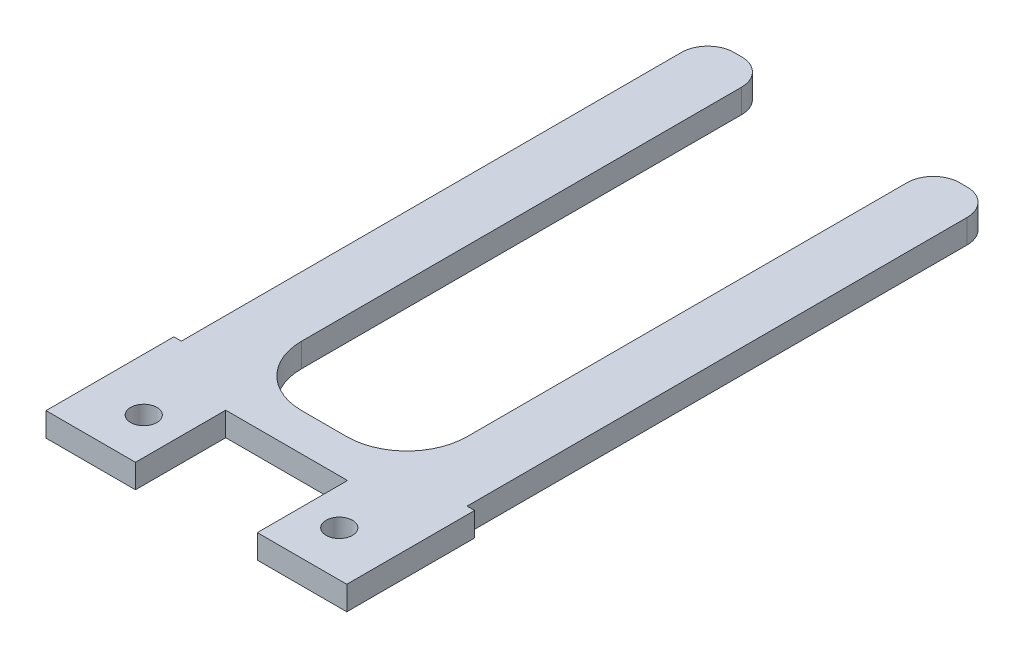
ISO-10303-21;
HEADER;
FILE_DESCRIPTION(('STEP AP214'),'2;1');
FILE_NAME('part.step','',(''),(''),'','','');
FILE_SCHEMA(('AUTOMOTIVE_DESIGN { 1 0 10303 214 1 1 1 1 }'));
ENDSEC;
DATA;
#1=APPLICATION_CONTEXT('core data for automotive mechanical design processes');
#2=APPLICATION_PROTOCOL_DEFINITION('international standard','automotive_design',2000,#1);
#3=PRODUCT_CONTEXT('',#1,'mechanical');
#4=PRODUCT('Part','Part','',(#3));
#5=PRODUCT_RELATED_PRODUCT_CATEGORY('part','',(#4));
#6=PRODUCT_DEFINITION_FORMATION('','',#4);
#7=PRODUCT_DEFINITION_CONTEXT('part definition',#1,'design');
#8=PRODUCT_DEFINITION('design','',#6,#7);
#9=PRODUCT_DEFINITION_SHAPE('','',#8);
#10=(LENGTH_UNIT() NAMED_UNIT(*) SI_UNIT(.MILLI.,.METRE.));
#11=(NAMED_UNIT(*) PLANE_ANGLE_UNIT() SI_UNIT($,.RADIAN.));
#12=(NAMED_UNIT(*) SI_UNIT($,.STERADIAN.) SOLID_ANGLE_UNIT());
#13=UNCERTAINTY_MEASURE_WITH_UNIT(LENGTH_MEASURE(1.E-05),#10,'distance_accuracy_value','');
#14=(GEOMETRIC_REPRESENTATION_CONTEXT(3) GLOBAL_UNCERTAINTY_ASSIGNED_CONTEXT((#13)) GLOBAL_UNIT_ASSIGNED_CONTEXT((#10,
#11,#12)) REPRESENTATION_CONTEXT('',''));
#15=CARTESIAN_POINT('',(0.,0.,0.));
#16=DIRECTION('',(0.,0.,1.));
#17=DIRECTION('',(1.,0.,0.));
#18=AXIS2_PLACEMENT_3D('',#15,#16,#17);
#19=CARTESIAN_POINT('',(15.5,1.5875,-71.5));
#20=DIRECTION('',(0.,-1.,0.));
#21=DIRECTION('',(0.,0.,-1.));
#22=AXIS2_PLACEMENT_3D('',#19,#20,#21);
#23=CYLINDRICAL_SURFACE('',#22,3.5);
#24=CARTESIAN_POINT('',(15.5,-1.5875,-71.5));
#25=DIRECTION('',(0.,1.,0.));
#26=DIRECTION('',(0.,0.,1.));
#27=AXIS2_PLACEMENT_3D('',#24,#25,#26);
#28=CIRCLE('',#27,3.5);
#29=CARTESIAN_POINT('',(15.5,-1.5875,-75.));
#30=VERTEX_POINT('',#29);
#31=CARTESIAN_POINT('',(19.,-1.5875,-71.5));
#32=VERTEX_POINT('',#31);
#33=EDGE_CURVE('E189',#30,#32,#28,.F.);
#34=ORIENTED_EDGE('',*,*,#33,.F.);
#35=DIRECTION('',(0.,-1.,0.));
#36=VECTOR('',#35,1.);
#37=CARTESIAN_POINT('',(15.5,1.5875,-75.));
#38=LINE('',#37,#36);
#39=CARTESIAN_POINT('',(15.5,1.5875,-75.));
#40=VERTEX_POINT('',#39);
#41=EDGE_CURVE('E184',#40,#30,#38,.T.);
#42=ORIENTED_EDGE('',*,*,#41,.F.);
#43=CARTESIAN_POINT('',(15.5,1.5875,-71.5));
#44=DIRECTION('',(0.,1.,0.));
#45=DIRECTION('',(0.,0.,1.));
#46=AXIS2_PLACEMENT_3D('',#43,#44,#45);
#47=CIRCLE('',#46,3.5);
#48=CARTESIAN_POINT('',(19.,1.5875,-71.5));
#49=VERTEX_POINT('',#48);
#50=EDGE_CURVE('E187',#40,#49,#47,.F.);
#51=ORIENTED_EDGE('',*,*,#50,.T.);
#52=DIRECTION('',(0.,-1.,0.));
#53=VECTOR('',#52,1.);
#54=CARTESIAN_POINT('',(19.,1.5875,-71.5));
#55=LINE('',#54,#53);
#56=EDGE_CURVE('E265',#49,#32,#55,.T.);
#57=ORIENTED_EDGE('',*,*,#56,.T.);
#58=EDGE_LOOP('',(#34,#42,#51,#57));
#59=FACE_BOUND('',#58,.T.);
#60=ADVANCED_FACE('F35',(#59),#23,.T.);
#61=CARTESIAN_POINT('',(0.,1.5875,-75.));
#62=DIRECTION('',(0.,0.,1.));
#63=DIRECTION('',(1.,0.,0.));
#64=AXIS2_PLACEMENT_3D('',#61,#62,#63);
#65=PLANE('',#64);
#66=DIRECTION('',(-1.,0.,0.));
#67=VECTOR('',#66,1.);
#68=CARTESIAN_POINT('',(0.,-1.5875,-75.));
#69=LINE('',#68,#67);
#70=CARTESIAN_POINT('',(14.5,-1.5875,-75.));
#71=VERTEX_POINT('',#70);
#72=EDGE_CURVE('E267',#30,#71,#69,.T.);
#73=ORIENTED_EDGE('',*,*,#72,.T.);
#74=DIRECTION('',(0.,-1.,0.));
#75=VECTOR('',#74,1.);
#76=CARTESIAN_POINT('',(14.5,1.5875,-75.));
#77=LINE('',#76,#75);
#78=CARTESIAN_POINT('',(14.5,1.5875,-75.));
#79=VERTEX_POINT('',#78);
#80=EDGE_CURVE('E194',#79,#71,#77,.T.);
#81=ORIENTED_EDGE('',*,*,#80,.F.);
#82=DIRECTION('',(-1.,0.,0.));
#83=VECTOR('',#82,1.);
#84=CARTESIAN_POINT('',(0.,1.5875,-75.));
#85=LINE('',#84,#83);
#86=EDGE_CURVE('E197',#40,#79,#85,.T.);
#87=ORIENTED_EDGE('',*,*,#86,.F.);
#88=ORIENTED_EDGE('',*,*,#41,.T.);
#89=EDGE_LOOP('',(#73,#81,#87,#88));
#90=FACE_BOUND('',#89,.T.);
#91=ADVANCED_FACE('F198',(#90),#65,.F.);
#92=CARTESIAN_POINT('',(14.5,1.5875,-71.5));
#93=DIRECTION('',(0.,-1.,0.));
#94=DIRECTION('',(0.,0.,-1.));
#95=AXIS2_PLACEMENT_3D('',#92,#93,#94);
#96=CYLINDRICAL_SURFACE('',#95,3.5);
#97=CARTESIAN_POINT('',(14.5,-1.5875,-71.5));
#98=DIRECTION('',(0.,1.,0.));
#99=DIRECTION('',(0.,0.,1.));
#100=AXIS2_PLACEMENT_3D('',#97,#98,#99);
#101=CIRCLE('',#100,3.5);
#102=CARTESIAN_POINT('',(11.,-1.5875,-71.5));
#103=VERTEX_POINT('',#102);
#104=EDGE_CURVE('E269',#103,#71,#101,.F.);
#105=ORIENTED_EDGE('',*,*,#104,.F.);
#106=DIRECTION('',(0.,-1.,0.));
#107=VECTOR('',#106,1.);
#108=CARTESIAN_POINT('',(11.,1.5875,-71.5));
#109=LINE('',#108,#107);
#110=CARTESIAN_POINT('',(11.,1.5875,-71.5));
#111=VERTEX_POINT('',#110);
#112=EDGE_CURVE('E354',#111,#103,#109,.T.);
#113=ORIENTED_EDGE('',*,*,#112,.F.);
#114=CARTESIAN_POINT('',(14.5,1.5875,-71.5));
#115=DIRECTION('',(0.,1.,0.));
#116=DIRECTION('',(0.,0.,1.));
#117=AXIS2_PLACEMENT_3D('',#114,#115,#116);
#118=CIRCLE('',#117,3.5);
#119=EDGE_CURVE('E201',#111,#79,#118,.F.);
#120=ORIENTED_EDGE('',*,*,#119,.T.);
#121=ORIENTED_EDGE('',*,*,#80,.T.);
#122=EDGE_LOOP('',(#105,#113,#120,#121));
#123=FACE_BOUND('',#122,.T.);
#124=ADVANCED_FACE('F440',(#123),#96,.T.);
#125=CARTESIAN_POINT('',(11.,1.5875,0.));
#126=DIRECTION('',(1.,0.,0.));
#127=DIRECTION('',(0.,0.,-1.));
#128=AXIS2_PLACEMENT_3D('',#125,#126,#127);
#129=PLANE('',#128);
#130=DIRECTION('',(0.,0.,1.));
#131=VECTOR('',#130,1.);
#132=CARTESIAN_POINT('',(11.,-1.5875,0.));
#133=LINE('',#132,#131);
#134=CARTESIAN_POINT('',(11.,-1.5875,-13.));
#135=VERTEX_POINT('',#134);
#136=EDGE_CURVE('E272',#103,#135,#133,.T.);
#137=ORIENTED_EDGE('',*,*,#136,.T.);
#138=DIRECTION('',(0.,-1.,0.));
#139=VECTOR('',#138,1.);
#140=CARTESIAN_POINT('',(11.,1.5875,-13.));
#141=LINE('',#140,#139);
#142=CARTESIAN_POINT('',(11.,1.5875,-13.));
#143=VERTEX_POINT('',#142);
#144=EDGE_CURVE('E361',#135,#143,#141,.F.);
#145=ORIENTED_EDGE('',*,*,#144,.T.);
#146=DIRECTION('',(0.,0.,1.));
#147=VECTOR('',#146,1.);
#148=CARTESIAN_POINT('',(11.,1.5875,0.));
#149=LINE('',#148,#147);
#150=EDGE_CURVE('E215',#111,#143,#149,.T.);
#151=ORIENTED_EDGE('',*,*,#150,.F.);
#152=ORIENTED_EDGE('',*,*,#112,.T.);
#153=EDGE_LOOP('',(#137,#145,#151,#152));
#154=FACE_BOUND('',#153,.T.);
#155=ADVANCED_FACE('F447',(#154),#129,.F.);
#156=CARTESIAN_POINT('',(0.,1.5875,-5.));
#157=DIRECTION('',(0.,0.,-1.));
#158=DIRECTION('',(-1.,0.,0.));
#159=AXIS2_PLACEMENT_3D('',#156,#157,#158);
#160=PLANE('',#159);
#161=DIRECTION('',(1.,0.,0.));
#162=VECTOR('',#161,1.);
#163=CARTESIAN_POINT('',(0.,1.5875,-5.));
#164=LINE('',#163,#162);
#165=CARTESIAN_POINT('',(-2.99999999999999,1.5875,-5.));
#166=VERTEX_POINT('',#165);
#167=CARTESIAN_POINT('',(2.99999999999999,1.5875,-5.));
#168=VERTEX_POINT('',#167);
#169=EDGE_CURVE('E218',#166,#168,#164,.T.);
#170=ORIENTED_EDGE('',*,*,#169,.T.);
#171=DIRECTION('',(0.,-1.,0.));
#172=VECTOR('',#171,1.);
#173=CARTESIAN_POINT('',(2.99999999999999,1.5875,-5.));
#174=LINE('',#173,#172);
#175=CARTESIAN_POINT('',(2.99999999999999,-1.5875,-5.));
#176=VERTEX_POINT('',#175);
#177=EDGE_CURVE('E358',#168,#176,#174,.T.);
#178=ORIENTED_EDGE('',*,*,#177,.T.);
#179=DIRECTION('',(1.,0.,0.));
#180=VECTOR('',#179,1.);
#181=CARTESIAN_POINT('',(0.,-1.5875,-5.));
#182=LINE('',#181,#180);
#183=CARTESIAN_POINT('',(-2.99999999999999,-1.5875,-5.));
#184=VERTEX_POINT('',#183);
#185=EDGE_CURVE('E275',#184,#176,#182,.T.);
#186=ORIENTED_EDGE('',*,*,#185,.F.);
#187=DIRECTION('',(0.,-1.,0.));
#188=VECTOR('',#187,1.);
#189=CARTESIAN_POINT('',(-2.99999999999999,1.5875,-5.));
#190=LINE('',#189,#188);
#191=EDGE_CURVE('E193',#184,#166,#190,.F.);
#192=ORIENTED_EDGE('',*,*,#191,.T.);
#193=EDGE_LOOP('',(#170,#178,#186,#192));
#194=FACE_BOUND('',#193,.T.);
#195=ADVANCED_FACE('F374',(#194),#160,.T.);
#196=CARTESIAN_POINT('',(-11.,1.5875,0.));
#197=DIRECTION('',(1.,0.,0.));
#198=DIRECTION('',(0.,0.,-1.));
#199=AXIS2_PLACEMENT_3D('',#196,#197,#198);
#200=PLANE('',#199);
#201=DIRECTION('',(0.,0.,1.));
#202=VECTOR('',#201,1.);
#203=CARTESIAN_POINT('',(-11.,1.5875,0.));
#204=LINE('',#203,#202);
#205=CARTESIAN_POINT('',(-11.,1.5875,-71.5));
#206=VERTEX_POINT('',#205);
#207=CARTESIAN_POINT('',(-11.,1.5875,-13.));
#208=VERTEX_POINT('',#207);
#209=EDGE_CURVE('E221',#206,#208,#204,.T.);
#210=ORIENTED_EDGE('',*,*,#209,.T.);
#211=DIRECTION('',(0.,-1.,0.));
#212=VECTOR('',#211,1.);
#213=CARTESIAN_POINT('',(-11.,-1.5875,-13.));
#214=LINE('',#213,#212);
#215=CARTESIAN_POINT('',(-11.,-1.5875,-13.));
#216=VERTEX_POINT('',#215);
#217=EDGE_CURVE('E363',#208,#216,#214,.T.);
#218=ORIENTED_EDGE('',*,*,#217,.T.);
#219=DIRECTION('',(0.,0.,1.));
#220=VECTOR('',#219,1.);
#221=CARTESIAN_POINT('',(-11.,-1.5875,0.));
#222=LINE('',#221,#220);
#223=CARTESIAN_POINT('',(-11.,-1.5875,-71.5));
#224=VERTEX_POINT('',#223);
#225=EDGE_CURVE('E278',#224,#216,#222,.T.);
#226=ORIENTED_EDGE('',*,*,#225,.F.);
#227=DIRECTION('',(0.,-1.,0.));
#228=VECTOR('',#227,1.);
#229=CARTESIAN_POINT('',(-11.,1.5875,-71.5));
#230=LINE('',#229,#228);
#231=EDGE_CURVE('E352',#206,#224,#230,.T.);
#232=ORIENTED_EDGE('',*,*,#231,.F.);
#233=EDGE_LOOP('',(#210,#218,#226,#232));
#234=FACE_BOUND('',#233,.T.);
#235=ADVANCED_FACE('F377',(#234),#200,.T.);
#236=CARTESIAN_POINT('',(-14.5,1.5875,-71.5));
#237=DIRECTION('',(0.,-1.,0.));
#238=DIRECTION('',(0.,0.,-1.));
#239=AXIS2_PLACEMENT_3D('',#236,#237,#238);
#240=CYLINDRICAL_SURFACE('',#239,3.5);
#241=CARTESIAN_POINT('',(-14.5,-1.5875,-71.5));
#242=DIRECTION('',(0.,1.,0.));
#243=DIRECTION('',(0.,0.,1.));
#244=AXIS2_PLACEMENT_3D('',#241,#242,#243);
#245=CIRCLE('',#244,3.5);
#246=CARTESIAN_POINT('',(-14.5,-1.5875,-75.));
#247=VERTEX_POINT('',#246);
#248=EDGE_CURVE('E281',#247,#224,#245,.F.);
#249=ORIENTED_EDGE('',*,*,#248,.F.);
#250=DIRECTION('',(0.,-1.,0.));
#251=VECTOR('',#250,1.);
#252=CARTESIAN_POINT('',(-14.5,1.5875,-75.));
#253=LINE('',#252,#251);
#254=CARTESIAN_POINT('',(-14.5,1.5875,-75.));
#255=VERTEX_POINT('',#254);
#256=EDGE_CURVE('E350',#255,#247,#253,.T.);
#257=ORIENTED_EDGE('',*,*,#256,.F.);
#258=CARTESIAN_POINT('',(-14.5,1.5875,-71.5));
#259=DIRECTION('',(0.,1.,0.));
#260=DIRECTION('',(0.,0.,1.));
#261=AXIS2_PLACEMENT_3D('',#258,#259,#260);
#262=CIRCLE('',#261,3.5);
#263=EDGE_CURVE('E223',#255,#206,#262,.F.);
#264=ORIENTED_EDGE('',*,*,#263,.T.);
#265=ORIENTED_EDGE('',*,*,#231,.T.);
#266=EDGE_LOOP('',(#249,#257,#264,#265));
#267=FACE_BOUND('',#266,.T.);
#268=ADVANCED_FACE('F382',(#267),#240,.T.);
#269=CARTESIAN_POINT('',(0.,1.5875,-75.));
#270=DIRECTION('',(0.,0.,-1.));
#271=DIRECTION('',(-1.,0.,0.));
#272=AXIS2_PLACEMENT_3D('',#269,#270,#271);
#273=PLANE('',#272);
#274=DIRECTION('',(1.,0.,0.));
#275=VECTOR('',#274,1.);
#276=CARTESIAN_POINT('',(0.,-1.5875,-75.));
#277=LINE('',#276,#275);
#278=CARTESIAN_POINT('',(-15.5,-1.5875,-75.));
#279=VERTEX_POINT('',#278);
#280=EDGE_CURVE('E284',#279,#247,#277,.T.);
#281=ORIENTED_EDGE('',*,*,#280,.F.);
#282=DIRECTION('',(0.,-1.,0.));
#283=VECTOR('',#282,1.);
#284=CARTESIAN_POINT('',(-15.5,1.5875,-75.));
#285=LINE('',#284,#283);
#286=CARTESIAN_POINT('',(-15.5,1.5875,-75.));
#287=VERTEX_POINT('',#286);
#288=EDGE_CURVE('E348',#287,#279,#285,.T.);
#289=ORIENTED_EDGE('',*,*,#288,.F.);
#290=DIRECTION('',(1.,0.,0.));
#291=VECTOR('',#290,1.);
#292=CARTESIAN_POINT('',(0.,1.5875,-75.));
#293=LINE('',#292,#291);
#294=EDGE_CURVE('E226',#287,#255,#293,.T.);
#295=ORIENTED_EDGE('',*,*,#294,.T.);
#296=ORIENTED_EDGE('',*,*,#256,.T.);
#297=EDGE_LOOP('',(#281,#289,#295,#296));
#298=FACE_BOUND('',#297,.T.);
#299=ADVANCED_FACE('F385',(#298),#273,.T.);
#300=CARTESIAN_POINT('',(-15.5,1.5875,-71.5));
#301=DIRECTION('',(0.,-1.,0.));
#302=DIRECTION('',(0.,0.,-1.));
#303=AXIS2_PLACEMENT_3D('',#300,#301,#302);
#304=CYLINDRICAL_SURFACE('',#303,3.5);
#305=CARTESIAN_POINT('',(-15.5,-1.5875,-71.5));
#306=DIRECTION('',(0.,1.,0.));
#307=DIRECTION('',(0.,0.,1.));
#308=AXIS2_PLACEMENT_3D('',#305,#306,#307);
#309=CIRCLE('',#308,3.5);
#310=CARTESIAN_POINT('',(-19.,-1.5875,-71.5));
#311=VERTEX_POINT('',#310);
#312=EDGE_CURVE('E287',#311,#279,#309,.F.);
#313=ORIENTED_EDGE('',*,*,#312,.F.);
#314=DIRECTION('',(0.,-1.,0.));
#315=VECTOR('',#314,1.);
#316=CARTESIAN_POINT('',(-19.,1.5875,-71.5));
#317=LINE('',#316,#315);
#318=CARTESIAN_POINT('',(-19.,1.5875,-71.5));
#319=VERTEX_POINT('',#318);
#320=EDGE_CURVE('E346',#319,#311,#317,.T.);
#321=ORIENTED_EDGE('',*,*,#320,.F.);
#322=CARTESIAN_POINT('',(-15.5,1.5875,-71.5));
#323=DIRECTION('',(0.,1.,0.));
#324=DIRECTION('',(0.,0.,1.));
#325=AXIS2_PLACEMENT_3D('',#322,#323,#324);
#326=CIRCLE('',#325,3.5);
#327=EDGE_CURVE('E229',#319,#287,#326,.F.);
#328=ORIENTED_EDGE('',*,*,#327,.T.);
#329=ORIENTED_EDGE('',*,*,#288,.T.);
#330=EDGE_LOOP('',(#313,#321,#328,#329));
#331=FACE_BOUND('',#330,.T.);
#332=ADVANCED_FACE('F390',(#331),#304,.T.);
#333=CARTESIAN_POINT('',(-19.,1.5875,0.));
#334=DIRECTION('',(-1.,0.,0.));
#335=DIRECTION('',(0.,0.,1.));
#336=AXIS2_PLACEMENT_3D('',#333,#334,#335);
#337=PLANE('',#336);
#338=DIRECTION('',(0.,0.,-1.));
#339=VECTOR('',#338,1.);
#340=CARTESIAN_POINT('',(-19.,-1.5875,0.));
#341=LINE('',#340,#339);
#342=CARTESIAN_POINT('',(-19.,-1.5875,-5.));
#343=VERTEX_POINT('',#342);
#344=EDGE_CURVE('E290',#343,#311,#341,.T.);
#345=ORIENTED_EDGE('',*,*,#344,.F.);
#346=DIRECTION('',(0.,-1.,0.));
#347=VECTOR('',#346,1.);
#348=CARTESIAN_POINT('',(-19.,1.5875,-5.));
#349=LINE('',#348,#347);
#350=CARTESIAN_POINT('',(-19.,1.5875,-5.));
#351=VERTEX_POINT('',#350);
#352=EDGE_CURVE('E344',#351,#343,#349,.T.);
#353=ORIENTED_EDGE('',*,*,#352,.F.);
#354=DIRECTION('',(0.,0.,-1.));
#355=VECTOR('',#354,1.);
#356=CARTESIAN_POINT('',(-19.,1.5875,0.));
#357=LINE('',#356,#355);
#358=EDGE_CURVE('E232',#351,#319,#357,.T.);
#359=ORIENTED_EDGE('',*,*,#358,.T.);
#360=ORIENTED_EDGE('',*,*,#320,.T.);
#361=EDGE_LOOP('',(#345,#353,#359,#360));
#362=FACE_BOUND('',#361,.T.);
#363=ADVANCED_FACE('F393',(#362),#337,.T.);
#364=CARTESIAN_POINT('',(0.,1.5875,-5.));
#365=DIRECTION('',(0.,0.,-1.));
#366=DIRECTION('',(-1.,0.,0.));
#367=AXIS2_PLACEMENT_3D('',#364,#365,#366);
#368=PLANE('',#367);
#369=DIRECTION('',(1.,0.,0.));
#370=VECTOR('',#369,1.);
#371=CARTESIAN_POINT('',(0.,-1.5875,-5.));
#372=LINE('',#371,#370);
#373=CARTESIAN_POINT('',(-20.,-1.5875,-5.));
#374=VERTEX_POINT('',#373);
#375=EDGE_CURVE('E293',#374,#343,#372,.T.);
#376=ORIENTED_EDGE('',*,*,#375,.F.);
#377=DIRECTION('',(0.,-1.,0.));
#378=VECTOR('',#377,1.);
#379=CARTESIAN_POINT('',(-20.,1.5875,-5.));
#380=LINE('',#379,#378);
#381=CARTESIAN_POINT('',(-20.,1.5875,-5.));
#382=VERTEX_POINT('',#381);
#383=EDGE_CURVE('E342',#382,#374,#380,.T.);
#384=ORIENTED_EDGE('',*,*,#383,.F.);
#385=DIRECTION('',(1.,0.,0.));
#386=VECTOR('',#385,1.);
#387=CARTESIAN_POINT('',(0.,1.5875,-5.));
#388=LINE('',#387,#386);
#389=EDGE_CURVE('E235',#382,#351,#388,.T.);
#390=ORIENTED_EDGE('',*,*,#389,.T.);
#391=ORIENTED_EDGE('',*,*,#352,.T.);
#392=EDGE_LOOP('',(#376,#384,#390,#391));
#393=FACE_BOUND('',#392,.T.);
#394=ADVANCED_FACE('F398',(#393),#368,.T.);
#395=CARTESIAN_POINT('',(-20.,1.5875,0.));
#396=DIRECTION('',(-1.,0.,0.));
#397=DIRECTION('',(0.,0.,1.));
#398=AXIS2_PLACEMENT_3D('',#395,#396,#397);
#399=PLANE('',#398);
#400=DIRECTION('',(0.,0.,-1.));
#401=VECTOR('',#400,1.);
#402=CARTESIAN_POINT('',(-20.,-1.5875,0.));
#403=LINE('',#402,#401);
#404=CARTESIAN_POINT('',(-20.,-1.5875,12.));
#405=VERTEX_POINT('',#404);
#406=EDGE_CURVE('E296',#405,#374,#403,.T.);
#407=ORIENTED_EDGE('',*,*,#406,.F.);
#408=DIRECTION('',(0.,-1.,0.));
#409=VECTOR('',#408,1.);
#410=CARTESIAN_POINT('',(-20.,1.5875,12.));
#411=LINE('',#410,#409);
#412=CARTESIAN_POINT('',(-20.,1.5875,12.));
#413=VERTEX_POINT('',#412);
#414=EDGE_CURVE('E340',#413,#405,#411,.T.);
#415=ORIENTED_EDGE('',*,*,#414,.F.);
#416=DIRECTION('',(0.,0.,-1.));
#417=VECTOR('',#416,1.);
#418=CARTESIAN_POINT('',(-20.,1.5875,0.));
#419=LINE('',#418,#417);
#420=EDGE_CURVE('E238',#413,#382,#419,.T.);
#421=ORIENTED_EDGE('',*,*,#420,.T.);
#422=ORIENTED_EDGE('',*,*,#383,.T.);
#423=EDGE_LOOP('',(#407,#415,#421,#422));
#424=FACE_BOUND('',#423,.T.);
#425=ADVANCED_FACE('F401',(#424),#399,.T.);
#426=CARTESIAN_POINT('',(0.,1.5875,12.));
#427=DIRECTION('',(0.,0.,1.));
#428=DIRECTION('',(1.,0.,0.));
#429=AXIS2_PLACEMENT_3D('',#426,#427,#428);
#430=PLANE('',#429);
#431=DIRECTION('',(-1.,0.,0.));
#432=VECTOR('',#431,1.);
#433=CARTESIAN_POINT('',(0.,-1.5875,12.));
#434=LINE('',#433,#432);
#435=CARTESIAN_POINT('',(-8.1,-1.5875,12.));
#436=VERTEX_POINT('',#435);
#437=EDGE_CURVE('E299',#436,#405,#434,.T.);
#438=ORIENTED_EDGE('',*,*,#437,.F.);
#439=DIRECTION('',(0.,-1.,0.));
#440=VECTOR('',#439,1.);
#441=CARTESIAN_POINT('',(-8.1,1.5875,12.));
#442=LINE('',#441,#440);
#443=CARTESIAN_POINT('',(-8.1,1.5875,12.));
#444=VERTEX_POINT('',#443);
#445=EDGE_CURVE('E338',#444,#436,#442,.T.);
#446=ORIENTED_EDGE('',*,*,#445,.F.);
#447=DIRECTION('',(-1.,0.,0.));
#448=VECTOR('',#447,1.);
#449=CARTESIAN_POINT('',(0.,1.5875,12.));
#450=LINE('',#449,#448);
#451=EDGE_CURVE('E241',#444,#413,#450,.T.);
#452=ORIENTED_EDGE('',*,*,#451,.T.);
#453=ORIENTED_EDGE('',*,*,#414,.T.);
#454=EDGE_LOOP('',(#438,#446,#452,#453));
#455=FACE_BOUND('',#454,.T.);
#456=ADVANCED_FACE('F406',(#455),#430,.T.);
#457=CARTESIAN_POINT('',(-8.1,1.5875,0.));
#458=DIRECTION('',(1.,0.,0.));
#459=DIRECTION('',(0.,0.,-1.));
#460=AXIS2_PLACEMENT_3D('',#457,#458,#459);
#461=PLANE('',#460);
#462=DIRECTION('',(0.,0.,1.));
#463=VECTOR('',#462,1.);
#464=CARTESIAN_POINT('',(-8.1,-1.5875,0.));
#465=LINE('',#464,#463);
#466=CARTESIAN_POINT('',(-8.1,-1.5875,0.));
#467=VERTEX_POINT('',#466);
#468=EDGE_CURVE('E302',#467,#436,#465,.T.);
#469=ORIENTED_EDGE('',*,*,#468,.F.);
#470=DIRECTION('',(0.,-1.,0.));
#471=VECTOR('',#470,1.);
#472=CARTESIAN_POINT('',(-8.1,1.5875,0.));
#473=LINE('',#472,#471);
#474=CARTESIAN_POINT('',(-8.1,1.5875,0.));
#475=VERTEX_POINT('',#474);
#476=EDGE_CURVE('E336',#475,#467,#473,.T.);
#477=ORIENTED_EDGE('',*,*,#476,.F.);
#478=DIRECTION('',(0.,0.,1.));
#479=VECTOR('',#478,1.);
#480=CARTESIAN_POINT('',(-8.1,1.5875,0.));
#481=LINE('',#480,#479);
#482=EDGE_CURVE('E244',#475,#444,#481,.T.);
#483=ORIENTED_EDGE('',*,*,#482,.T.);
#484=ORIENTED_EDGE('',*,*,#445,.T.);
#485=EDGE_LOOP('',(#469,#477,#483,#484));
#486=FACE_BOUND('',#485,.T.);
#487=ADVANCED_FACE('F409',(#486),#461,.T.);
#488=CARTESIAN_POINT('',(0.,1.5875,0.));
#489=DIRECTION('',(0.,0.,1.));
#490=DIRECTION('',(1.,0.,0.));
#491=AXIS2_PLACEMENT_3D('',#488,#489,#490);
#492=PLANE('',#491);
#493=DIRECTION('',(-1.,0.,0.));
#494=VECTOR('',#493,1.);
#495=CARTESIAN_POINT('',(0.,-1.5875,0.));
#496=LINE('',#495,#494);
#497=CARTESIAN_POINT('',(8.1,-1.5875,0.));
#498=VERTEX_POINT('',#497);
#499=EDGE_CURVE('E305',#498,#467,#496,.T.);
#500=ORIENTED_EDGE('',*,*,#499,.F.);
#501=DIRECTION('',(0.,-1.,0.));
#502=VECTOR('',#501,1.);
#503=CARTESIAN_POINT('',(8.1,1.5875,0.));
#504=LINE('',#503,#502);
#505=CARTESIAN_POINT('',(8.1,1.5875,0.));
#506=VERTEX_POINT('',#505);
#507=EDGE_CURVE('E334',#506,#498,#504,.T.);
#508=ORIENTED_EDGE('',*,*,#507,.F.);
#509=DIRECTION('',(-1.,0.,0.));
#510=VECTOR('',#509,1.);
#511=CARTESIAN_POINT('',(0.,1.5875,0.));
#512=LINE('',#511,#510);
#513=EDGE_CURVE('E247',#506,#475,#512,.T.);
#514=ORIENTED_EDGE('',*,*,#513,.T.);
#515=ORIENTED_EDGE('',*,*,#476,.T.);
#516=EDGE_LOOP('',(#500,#508,#514,#515));
#517=FACE_BOUND('',#516,.T.);
#518=ADVANCED_FACE('F413',(#517),#492,.T.);
#519=CARTESIAN_POINT('',(8.1,1.5875,0.));
#520=DIRECTION('',(1.,0.,0.));
#521=DIRECTION('',(0.,0.,-1.));
#522=AXIS2_PLACEMENT_3D('',#519,#520,#521);
#523=PLANE('',#522);
#524=DIRECTION('',(0.,0.,1.));
#525=VECTOR('',#524,1.);
#526=CARTESIAN_POINT('',(8.1,-1.5875,0.));
#527=LINE('',#526,#525);
#528=CARTESIAN_POINT('',(8.1,-1.5875,12.));
#529=VERTEX_POINT('',#528);
#530=EDGE_CURVE('E308',#498,#529,#527,.T.);
#531=ORIENTED_EDGE('',*,*,#530,.T.);
#532=DIRECTION('',(0.,-1.,0.));
#533=VECTOR('',#532,1.);
#534=CARTESIAN_POINT('',(8.1,1.5875,12.));
#535=LINE('',#534,#533);
#536=CARTESIAN_POINT('',(8.1,1.5875,12.));
#537=VERTEX_POINT('',#536);
#538=EDGE_CURVE('E331',#537,#529,#535,.T.);
#539=ORIENTED_EDGE('',*,*,#538,.F.);
#540=DIRECTION('',(0.,0.,1.));
#541=VECTOR('',#540,1.);
#542=CARTESIAN_POINT('',(8.1,1.5875,0.));
#543=LINE('',#542,#541);
#544=EDGE_CURVE('E250',#506,#537,#543,.T.);
#545=ORIENTED_EDGE('',*,*,#544,.F.);
#546=ORIENTED_EDGE('',*,*,#507,.T.);
#547=EDGE_LOOP('',(#531,#539,#545,#546));
#548=FACE_BOUND('',#547,.T.);
#549=ADVANCED_FACE('F418',(#548),#523,.F.);
#550=CARTESIAN_POINT('',(0.,1.5875,12.));
#551=DIRECTION('',(0.,0.,-1.));
#552=DIRECTION('',(-1.,0.,0.));
#553=AXIS2_PLACEMENT_3D('',#550,#551,#552);
#554=PLANE('',#553);
#555=DIRECTION('',(1.,0.,0.));
#556=VECTOR('',#555,1.);
#557=CARTESIAN_POINT('',(0.,-1.5875,12.));
#558=LINE('',#557,#556);
#559=CARTESIAN_POINT('',(20.,-1.5875,12.));
#560=VERTEX_POINT('',#559);
#561=EDGE_CURVE('E310',#529,#560,#558,.T.);
#562=ORIENTED_EDGE('',*,*,#561,.T.);
#563=DIRECTION('',(0.,-1.,0.));
#564=VECTOR('',#563,1.);
#565=CARTESIAN_POINT('',(20.,1.5875,12.));
#566=LINE('',#565,#564);
#567=CARTESIAN_POINT('',(20.,1.5875,12.));
#568=VERTEX_POINT('',#567);
#569=EDGE_CURVE('E328',#568,#560,#566,.T.);
#570=ORIENTED_EDGE('',*,*,#569,.F.);
#571=DIRECTION('',(1.,0.,0.));
#572=VECTOR('',#571,1.);
#573=CARTESIAN_POINT('',(0.,1.5875,12.));
#574=LINE('',#573,#572);
#575=EDGE_CURVE('E252',#537,#568,#574,.T.);
#576=ORIENTED_EDGE('',*,*,#575,.F.);
#577=ORIENTED_EDGE('',*,*,#538,.T.);
#578=EDGE_LOOP('',(#562,#570,#576,#577));
#579=FACE_BOUND('',#578,.T.);
#580=ADVANCED_FACE('F424',(#579),#554,.F.);
#581=CARTESIAN_POINT('',(20.,1.5875,0.));
#582=DIRECTION('',(-1.,0.,0.));
#583=DIRECTION('',(0.,0.,1.));
#584=AXIS2_PLACEMENT_3D('',#581,#582,#583);
#585=PLANE('',#584);
#586=DIRECTION('',(0.,0.,-1.));
#587=VECTOR('',#586,1.);
#588=CARTESIAN_POINT('',(20.,-1.5875,0.));
#589=LINE('',#588,#587);
#590=CARTESIAN_POINT('',(20.,-1.5875,-5.));
#591=VERTEX_POINT('',#590);
#592=EDGE_CURVE('E312',#560,#591,#589,.T.);
#593=ORIENTED_EDGE('',*,*,#592,.T.);
#594=DIRECTION('',(0.,-1.,0.));
#595=VECTOR('',#594,1.);
#596=CARTESIAN_POINT('',(20.,1.5875,-5.));
#597=LINE('',#596,#595);
#598=CARTESIAN_POINT('',(20.,1.5875,-5.));
#599=VERTEX_POINT('',#598);
#600=EDGE_CURVE('E325',#599,#591,#597,.T.);
#601=ORIENTED_EDGE('',*,*,#600,.F.);
#602=DIRECTION('',(0.,0.,-1.));
#603=VECTOR('',#602,1.);
#604=CARTESIAN_POINT('',(20.,1.5875,0.));
#605=LINE('',#604,#603);
#606=EDGE_CURVE('E254',#568,#599,#605,.T.);
#607=ORIENTED_EDGE('',*,*,#606,.F.);
#608=ORIENTED_EDGE('',*,*,#569,.T.);
#609=EDGE_LOOP('',(#593,#601,#607,#608));
#610=FACE_BOUND('',#609,.T.);
#611=ADVANCED_FACE('F428',(#610),#585,.F.);
#612=CARTESIAN_POINT('',(0.,1.5875,-5.));
#613=DIRECTION('',(0.,0.,1.));
#614=DIRECTION('',(1.,0.,0.));
#615=AXIS2_PLACEMENT_3D('',#612,#613,#614);
#616=PLANE('',#615);
#617=DIRECTION('',(-1.,0.,0.));
#618=VECTOR('',#617,1.);
#619=CARTESIAN_POINT('',(0.,-1.5875,-5.));
#620=LINE('',#619,#618);
#621=CARTESIAN_POINT('',(19.,-1.5875,-5.));
#622=VERTEX_POINT('',#621);
#623=EDGE_CURVE('E314',#591,#622,#620,.T.);
#624=ORIENTED_EDGE('',*,*,#623,.T.);
#625=DIRECTION('',(0.,-1.,0.));
#626=VECTOR('',#625,1.);
#627=CARTESIAN_POINT('',(19.,1.5875,-5.));
#628=LINE('',#627,#626);
#629=CARTESIAN_POINT('',(19.,1.5875,-5.));
#630=VERTEX_POINT('',#629);
#631=EDGE_CURVE('E322',#630,#622,#628,.T.);
#632=ORIENTED_EDGE('',*,*,#631,.F.);
#633=DIRECTION('',(-1.,0.,0.));
#634=VECTOR('',#633,1.);
#635=CARTESIAN_POINT('',(0.,1.5875,-5.));
#636=LINE('',#635,#634);
#637=EDGE_CURVE('E256',#599,#630,#636,.T.);
#638=ORIENTED_EDGE('',*,*,#637,.F.);
#639=ORIENTED_EDGE('',*,*,#600,.T.);
#640=EDGE_LOOP('',(#624,#632,#638,#639));
#641=FACE_BOUND('',#640,.T.);
#642=ADVANCED_FACE('F433',(#641),#616,.F.);
#643=CARTESIAN_POINT('',(13.,1.5875,6.));
#644=DIRECTION('',(0.,-1.,0.));
#645=DIRECTION('',(0.,0.,-1.));
#646=AXIS2_PLACEMENT_3D('',#643,#644,#645);
#647=CYLINDRICAL_SURFACE('',#646,1.75);
#648=CARTESIAN_POINT('',(13.,1.5875,6.));
#649=DIRECTION('',(0.,1.,0.));
#650=DIRECTION('',(0.,0.,1.));
#651=AXIS2_PLACEMENT_3D('',#648,#649,#650);
#652=CIRCLE('',#651,1.75);
#653=CARTESIAN_POINT('',(13.,1.5875,7.75));
#654=VERTEX_POINT('',#653);
#655=EDGE_CURVE('E259',#654,#654,#652,.F.);
#656=ORIENTED_EDGE('',*,*,#655,.F.);
#657=EDGE_LOOP('',(#656));
#658=FACE_BOUND('',#657,.T.);
#659=CARTESIAN_POINT('',(13.,-1.5875,6.));
#660=DIRECTION('',(0.,1.,0.));
#661=DIRECTION('',(0.,0.,1.));
#662=AXIS2_PLACEMENT_3D('',#659,#660,#661);
#663=CIRCLE('',#662,1.75);
#664=CARTESIAN_POINT('',(13.,-1.5875,7.75));
#665=VERTEX_POINT('',#664);
#666=EDGE_CURVE('E211',#665,#665,#663,.F.);
#667=ORIENTED_EDGE('',*,*,#666,.T.);
#668=EDGE_LOOP('',(#667));
#669=FACE_BOUND('',#668,.T.);
#670=ADVANCED_FACE('F477',(#658,#669),#647,.F.);
#671=CARTESIAN_POINT('',(19.,1.5875,0.));
#672=DIRECTION('',(-1.,0.,0.));
#673=DIRECTION('',(0.,0.,1.));
#674=AXIS2_PLACEMENT_3D('',#671,#672,#673);
#675=PLANE('',#674);
#676=DIRECTION('',(0.,0.,-1.));
#677=VECTOR('',#676,1.);
#678=CARTESIAN_POINT('',(19.,-1.5875,0.));
#679=LINE('',#678,#677);
#680=EDGE_CURVE('E316',#622,#32,#679,.T.);
#681=ORIENTED_EDGE('',*,*,#680,.T.);
#682=ORIENTED_EDGE('',*,*,#56,.F.);
#683=DIRECTION('',(0.,0.,-1.));
#684=VECTOR('',#683,1.);
#685=CARTESIAN_POINT('',(19.,1.5875,0.));
#686=LINE('',#685,#684);
#687=EDGE_CURVE('E206',#630,#49,#686,.T.);
#688=ORIENTED_EDGE('',*,*,#687,.F.);
#689=ORIENTED_EDGE('',*,*,#631,.T.);
#690=EDGE_LOOP('',(#681,#682,#688,#689));
#691=FACE_BOUND('',#690,.T.);
#692=ADVANCED_FACE('F436',(#691),#675,.F.);
#693=CARTESIAN_POINT('',(-13.,1.5875,6.));
#694=DIRECTION('',(0.,-1.,0.));
#695=DIRECTION('',(0.,0.,-1.));
#696=AXIS2_PLACEMENT_3D('',#693,#694,#695);
#697=CYLINDRICAL_SURFACE('',#696,1.75);
#698=CARTESIAN_POINT('',(-13.,1.5875,6.));
#699=DIRECTION('',(0.,1.,0.));
#700=DIRECTION('',(0.,0.,1.));
#701=AXIS2_PLACEMENT_3D('',#698,#699,#700);
#702=CIRCLE('',#701,1.75);
#703=CARTESIAN_POINT('',(-13.,1.5875,7.75));
#704=VERTEX_POINT('',#703);
#705=EDGE_CURVE('E262',#704,#704,#702,.T.);
#706=ORIENTED_EDGE('',*,*,#705,.T.);
#707=EDGE_LOOP('',(#706));
#708=FACE_BOUND('',#707,.T.);
#709=CARTESIAN_POINT('',(-13.,-1.5875,6.));
#710=DIRECTION('',(0.,1.,0.));
#711=DIRECTION('',(0.,0.,1.));
#712=AXIS2_PLACEMENT_3D('',#709,#710,#711);
#713=CIRCLE('',#712,1.75);
#714=CARTESIAN_POINT('',(-13.,-1.5875,7.75));
#715=VERTEX_POINT('',#714);
#716=EDGE_CURVE('E208',#715,#715,#713,.T.);
#717=ORIENTED_EDGE('',*,*,#716,.F.);
#718=EDGE_LOOP('',(#717));
#719=FACE_BOUND('',#718,.T.);
#720=ADVANCED_FACE('F471',(#708,#719),#697,.F.);
#721=CARTESIAN_POINT('',(0.,1.5875,0.));
#722=DIRECTION('',(0.,1.,0.));
#723=DIRECTION('',(0.,0.,1.));
#724=AXIS2_PLACEMENT_3D('',#721,#722,#723);
#725=PLANE('',#724);
#726=ORIENTED_EDGE('',*,*,#50,.F.);
#727=ORIENTED_EDGE('',*,*,#86,.T.);
#728=ORIENTED_EDGE('',*,*,#119,.F.);
#729=ORIENTED_EDGE('',*,*,#150,.T.);
#730=CARTESIAN_POINT('',(2.99999999999999,1.5875,-13.));
#731=DIRECTION('',(0.,1.,0.));
#732=DIRECTION('',(0.,0.,1.));
#733=AXIS2_PLACEMENT_3D('',#730,#731,#732);
#734=CIRCLE('',#733,8.);
#735=EDGE_CURVE('E367',#143,#168,#734,.F.);
#736=ORIENTED_EDGE('',*,*,#735,.T.);
#737=ORIENTED_EDGE('',*,*,#169,.F.);
#738=CARTESIAN_POINT('',(-2.99999999999999,1.5875,-13.));
#739=DIRECTION('',(0.,1.,0.));
#740=DIRECTION('',(0.,0.,1.));
#741=AXIS2_PLACEMENT_3D('',#738,#739,#740);
#742=CIRCLE('',#741,8.);
#743=EDGE_CURVE('E11',#166,#208,#742,.F.);
#744=ORIENTED_EDGE('',*,*,#743,.T.);
#745=ORIENTED_EDGE('',*,*,#209,.F.);
#746=ORIENTED_EDGE('',*,*,#263,.F.);
#747=ORIENTED_EDGE('',*,*,#294,.F.);
#748=ORIENTED_EDGE('',*,*,#327,.F.);
#749=ORIENTED_EDGE('',*,*,#358,.F.);
#750=ORIENTED_EDGE('',*,*,#389,.F.);
#751=ORIENTED_EDGE('',*,*,#420,.F.);
#752=ORIENTED_EDGE('',*,*,#451,.F.);
#753=ORIENTED_EDGE('',*,*,#482,.F.);
#754=ORIENTED_EDGE('',*,*,#513,.F.);
#755=ORIENTED_EDGE('',*,*,#544,.T.);
#756=ORIENTED_EDGE('',*,*,#575,.T.);
#757=ORIENTED_EDGE('',*,*,#606,.T.);
#758=ORIENTED_EDGE('',*,*,#637,.T.);
#759=ORIENTED_EDGE('',*,*,#687,.T.);
#760=EDGE_LOOP('',(#726,#727,#728,#729,#736,#737,#744,#745,#746,#747,#748,#749,#750,#751,#752,
#753,#754,#755,#756,#757,#758,#759));
#761=FACE_BOUND('',#760,.T.);
#762=ORIENTED_EDGE('',*,*,#655,.T.);
#763=EDGE_LOOP('',(#762));
#764=FACE_BOUND('',#763,.T.);
#765=ORIENTED_EDGE('',*,*,#705,.F.);
#766=EDGE_LOOP('',(#765));
#767=FACE_BOUND('',#766,.T.);
#768=ADVANCED_FACE('F203',(#761,#764,#767),#725,.T.);
#769=CARTESIAN_POINT('',(0.,-1.5875,0.));
#770=DIRECTION('',(0.,1.,0.));
#771=DIRECTION('',(0.,0.,1.));
#772=AXIS2_PLACEMENT_3D('',#769,#770,#771);
#773=PLANE('',#772);
#774=ORIENTED_EDGE('',*,*,#33,.T.);
#775=ORIENTED_EDGE('',*,*,#680,.F.);
#776=ORIENTED_EDGE('',*,*,#623,.F.);
#777=ORIENTED_EDGE('',*,*,#592,.F.);
#778=ORIENTED_EDGE('',*,*,#561,.F.);
#779=ORIENTED_EDGE('',*,*,#530,.F.);
#780=ORIENTED_EDGE('',*,*,#499,.T.);
#781=ORIENTED_EDGE('',*,*,#468,.T.);
#782=ORIENTED_EDGE('',*,*,#437,.T.);
#783=ORIENTED_EDGE('',*,*,#406,.T.);
#784=ORIENTED_EDGE('',*,*,#375,.T.);
#785=ORIENTED_EDGE('',*,*,#344,.T.);
#786=ORIENTED_EDGE('',*,*,#312,.T.);
#787=ORIENTED_EDGE('',*,*,#280,.T.);
#788=ORIENTED_EDGE('',*,*,#248,.T.);
#789=ORIENTED_EDGE('',*,*,#225,.T.);
#790=CARTESIAN_POINT('',(-2.99999999999999,-1.5875,-13.));
#791=DIRECTION('',(0.,1.,0.));
#792=DIRECTION('',(0.,0.,1.));
#793=AXIS2_PLACEMENT_3D('',#790,#791,#792);
#794=CIRCLE('',#793,8.);
#795=EDGE_CURVE('E43',#216,#184,#794,.T.);
#796=ORIENTED_EDGE('',*,*,#795,.T.);
#797=ORIENTED_EDGE('',*,*,#185,.T.);
#798=CARTESIAN_POINT('',(2.99999999999999,-1.5875,-13.));
#799=DIRECTION('',(0.,1.,0.));
#800=DIRECTION('',(0.,0.,1.));
#801=AXIS2_PLACEMENT_3D('',#798,#799,#800);
#802=CIRCLE('',#801,8.);
#803=EDGE_CURVE('E365',#176,#135,#802,.T.);
#804=ORIENTED_EDGE('',*,*,#803,.T.);
#805=ORIENTED_EDGE('',*,*,#136,.F.);
#806=ORIENTED_EDGE('',*,*,#104,.T.);
#807=ORIENTED_EDGE('',*,*,#72,.F.);
#808=EDGE_LOOP('',(#774,#775,#776,#777,#778,#779,#780,#781,#782,#783,#784,#785,#786,#787,#788,
#789,#796,#797,#804,#805,#806,#807));
#809=FACE_BOUND('',#808,.T.);
#810=ORIENTED_EDGE('',*,*,#666,.F.);
#811=EDGE_LOOP('',(#810));
#812=FACE_BOUND('',#811,.T.);
#813=ORIENTED_EDGE('',*,*,#716,.T.);
#814=EDGE_LOOP('',(#813));
#815=FACE_BOUND('',#814,.T.);
#816=ADVANCED_FACE('F370',(#809,#812,#815),#773,.F.);
#817=CARTESIAN_POINT('',(2.99999999999999,1.5875,-13.));
#818=DIRECTION('',(0.,-1.,0.));
#819=DIRECTION('',(0.,0.,-1.));
#820=AXIS2_PLACEMENT_3D('',#817,#818,#819);
#821=CYLINDRICAL_SURFACE('',#820,8.);
#822=ORIENTED_EDGE('',*,*,#735,.F.);
#823=ORIENTED_EDGE('',*,*,#144,.F.);
#824=ORIENTED_EDGE('',*,*,#803,.F.);
#825=ORIENTED_EDGE('',*,*,#177,.F.);
#826=EDGE_LOOP('',(#822,#823,#824,#825));
#827=FACE_BOUND('',#826,.T.);
#828=ADVANCED_FACE('F446',(#827),#821,.F.);
#829=CARTESIAN_POINT('',(-2.99999999999999,1.5875,-13.));
#830=DIRECTION('',(0.,1.,0.));
#831=DIRECTION('',(0.,0.,1.));
#832=AXIS2_PLACEMENT_3D('',#829,#830,#831);
#833=CYLINDRICAL_SURFACE('',#832,8.);
#834=ORIENTED_EDGE('',*,*,#743,.F.);
#835=ORIENTED_EDGE('',*,*,#191,.F.);
#836=ORIENTED_EDGE('',*,*,#795,.F.);
#837=ORIENTED_EDGE('',*,*,#217,.F.);
#838=EDGE_LOOP('',(#834,#835,#836,#837));
#839=FACE_BOUND('',#838,.T.);
#840=ADVANCED_FACE('F37',(#839),#833,.F.);
#841=CLOSED_SHELL('',(#60,#91,#124,#155,#195,#235,#268,#299,#332,#363,#394,#425,#456,#487,#518,
#549,#580,#611,#642,#670,#692,#720,#768,#816,#828,#840));
#842=MANIFOLD_SOLID_BREP('B2',#841);
#843=ADVANCED_BREP_SHAPE_REPRESENTATION('',(#18,#842),#14);
#844=SHAPE_DEFINITION_REPRESENTATION(#9,#843);
ENDSEC;
END-ISO-10303-21;
